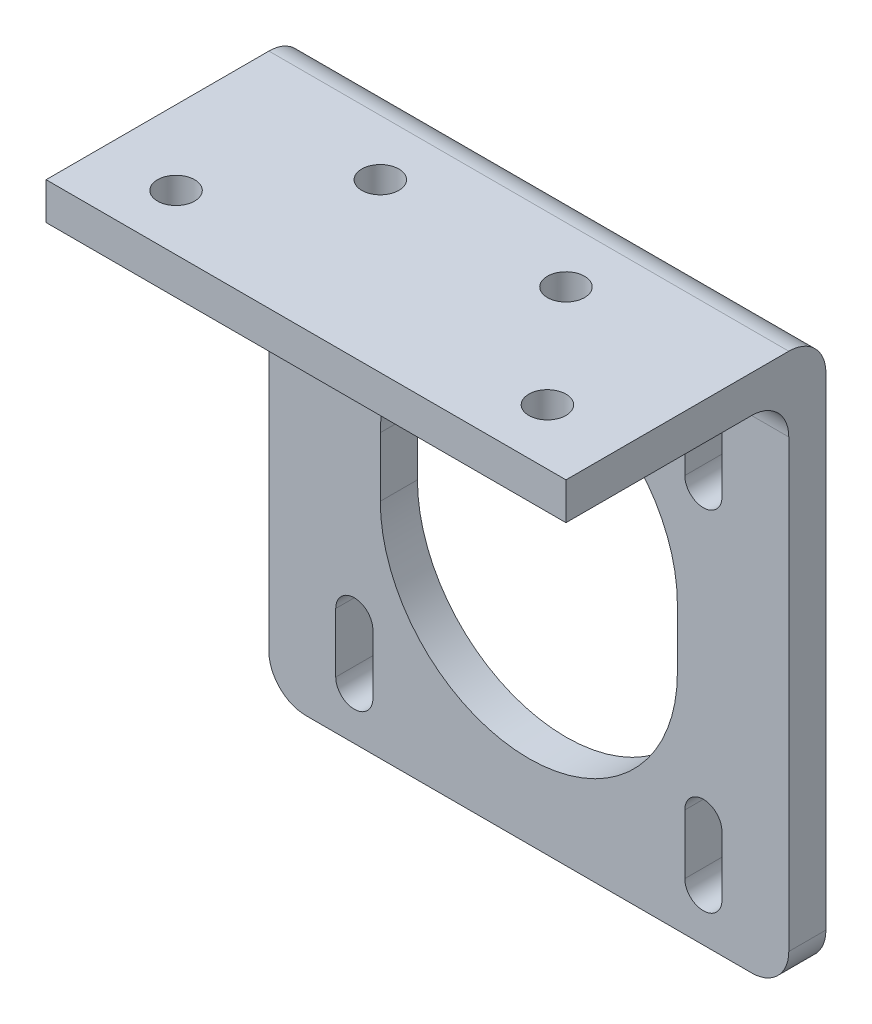
ISO-10303-21;
HEADER;
FILE_DESCRIPTION(('STEP AP214'),'2;1');
FILE_NAME('part.step','',(''),(''),'','','');
FILE_SCHEMA(('AUTOMOTIVE_DESIGN { 1 0 10303 214 1 1 1 1 }'));
ENDSEC;
DATA;
#1=APPLICATION_CONTEXT('core data for automotive mechanical design processes');
#2=APPLICATION_PROTOCOL_DEFINITION('international standard','automotive_design',2000,#1);
#3=PRODUCT_CONTEXT('',#1,'mechanical');
#4=PRODUCT('Part','Part','',(#3));
#5=PRODUCT_RELATED_PRODUCT_CATEGORY('part','',(#4));
#6=PRODUCT_DEFINITION_FORMATION('','',#4);
#7=PRODUCT_DEFINITION_CONTEXT('part definition',#1,'design');
#8=PRODUCT_DEFINITION('design','',#6,#7);
#9=PRODUCT_DEFINITION_SHAPE('','',#8);
#10=(LENGTH_UNIT() NAMED_UNIT(*) SI_UNIT(.MILLI.,.METRE.));
#11=(NAMED_UNIT(*) PLANE_ANGLE_UNIT() SI_UNIT($,.RADIAN.));
#12=(NAMED_UNIT(*) SI_UNIT($,.STERADIAN.) SOLID_ANGLE_UNIT());
#13=UNCERTAINTY_MEASURE_WITH_UNIT(LENGTH_MEASURE(1.E-05),#10,'distance_accuracy_value','');
#14=(GEOMETRIC_REPRESENTATION_CONTEXT(3) GLOBAL_UNCERTAINTY_ASSIGNED_CONTEXT((#13)) GLOBAL_UNIT_ASSIGNED_CONTEXT((#10,
#11,#12)) REPRESENTATION_CONTEXT('',''));
#15=CARTESIAN_POINT('',(0.,0.,0.));
#16=DIRECTION('',(0.,0.,1.));
#17=DIRECTION('',(1.,0.,0.));
#18=AXIS2_PLACEMENT_3D('',#15,#16,#17);
#19=CARTESIAN_POINT('',(-30.,-32.5,5.));
#20=DIRECTION('',(0.,0.,-1.));
#21=DIRECTION('',(-1.,0.,0.));
#22=AXIS2_PLACEMENT_3D('',#19,#20,#21);
#23=PLANE('',#22);
#24=DIRECTION('',(0.,-1.,0.));
#25=VECTOR('',#24,1.);
#26=CARTESIAN_POINT('',(-26.,24.,5.));
#27=LINE('',#26,#25);
#28=CARTESIAN_POINT('',(-26.,24.,5.));
#29=VERTEX_POINT('',#28);
#30=CARTESIAN_POINT('',(-26.,16.,5.));
#31=VERTEX_POINT('',#30);
#32=EDGE_CURVE('E485',#29,#31,#27,.T.);
#33=ORIENTED_EDGE('',*,*,#32,.F.);
#34=CARTESIAN_POINT('',(-23.5,24.,5.));
#35=DIRECTION('',(0.,0.,1.));
#36=DIRECTION('',(1.,0.,0.));
#37=AXIS2_PLACEMENT_3D('',#34,#35,#36);
#38=CIRCLE('',#37,2.49999999999999);
#39=CARTESIAN_POINT('',(-21.,24.,5.));
#40=VERTEX_POINT('',#39);
#41=EDGE_CURVE('E413',#40,#29,#38,.T.);
#42=ORIENTED_EDGE('',*,*,#41,.F.);
#43=DIRECTION('',(0.,1.,0.));
#44=VECTOR('',#43,1.);
#45=CARTESIAN_POINT('',(-21.,24.,5.));
#46=LINE('',#45,#44);
#47=CARTESIAN_POINT('',(-21.,16.,5.));
#48=VERTEX_POINT('',#47);
#49=EDGE_CURVE('E470',#48,#40,#46,.T.);
#50=ORIENTED_EDGE('',*,*,#49,.F.);
#51=CARTESIAN_POINT('',(-23.5,16.,5.));
#52=DIRECTION('',(0.,0.,1.));
#53=DIRECTION('',(1.,0.,0.));
#54=AXIS2_PLACEMENT_3D('',#51,#52,#53);
#55=CIRCLE('',#54,2.49999999999999);
#56=EDGE_CURVE('E489',#31,#48,#55,.T.);
#57=ORIENTED_EDGE('',*,*,#56,.F.);
#58=EDGE_LOOP('',(#33,#42,#50,#57));
#59=FACE_BOUND('',#58,.T.);
#60=DIRECTION('',(0.,-1.,0.));
#61=VECTOR('',#60,1.);
#62=CARTESIAN_POINT('',(-20.,0.500000000000003,5.));
#63=LINE('',#62,#61);
#64=CARTESIAN_POINT('',(-20.,0.5,5.));
#65=VERTEX_POINT('',#64);
#66=CARTESIAN_POINT('',(-20.,-7.5,5.));
#67=VERTEX_POINT('',#66);
#68=EDGE_CURVE('E355',#65,#67,#63,.T.);
#69=ORIENTED_EDGE('',*,*,#68,.F.);
#70=CARTESIAN_POINT('',(0.,0.5,5.));
#71=DIRECTION('',(0.,0.,1.));
#72=DIRECTION('',(1.,0.,0.));
#73=AXIS2_PLACEMENT_3D('',#70,#71,#72);
#74=CIRCLE('',#73,20.);
#75=CARTESIAN_POINT('',(20.,0.499999999999998,5.));
#76=VERTEX_POINT('',#75);
#77=EDGE_CURVE('E288',#76,#65,#74,.T.);
#78=ORIENTED_EDGE('',*,*,#77,.F.);
#79=DIRECTION('',(0.,1.,0.));
#80=VECTOR('',#79,1.);
#81=CARTESIAN_POINT('',(20.,0.499999999999998,5.));
#82=LINE('',#81,#80);
#83=CARTESIAN_POINT('',(20.,-7.5,5.));
#84=VERTEX_POINT('',#83);
#85=EDGE_CURVE('E340',#84,#76,#82,.T.);
#86=ORIENTED_EDGE('',*,*,#85,.F.);
#87=CARTESIAN_POINT('',(0.,-7.5,5.));
#88=DIRECTION('',(0.,0.,1.));
#89=DIRECTION('',(1.,0.,0.));
#90=AXIS2_PLACEMENT_3D('',#87,#88,#89);
#91=CIRCLE('',#90,20.);
#92=EDGE_CURVE('E359',#67,#84,#91,.T.);
#93=ORIENTED_EDGE('',*,*,#92,.F.);
#94=EDGE_LOOP('',(#69,#78,#86,#93));
#95=FACE_BOUND('',#94,.T.);
#96=DIRECTION('',(0.,-1.,0.));
#97=VECTOR('',#96,1.);
#98=CARTESIAN_POINT('',(21.,-23.,5.));
#99=LINE('',#98,#97);
#100=CARTESIAN_POINT('',(21.,-23.,5.));
#101=VERTEX_POINT('',#100);
#102=CARTESIAN_POINT('',(21.,-31.,5.));
#103=VERTEX_POINT('',#102);
#104=EDGE_CURVE('E310',#101,#103,#99,.T.);
#105=ORIENTED_EDGE('',*,*,#104,.F.);
#106=CARTESIAN_POINT('',(23.5,-23.,5.));
#107=DIRECTION('',(0.,0.,1.));
#108=DIRECTION('',(1.,0.,0.));
#109=AXIS2_PLACEMENT_3D('',#106,#107,#108);
#110=CIRCLE('',#109,2.5);
#111=CARTESIAN_POINT('',(26.,-23.,5.));
#112=VERTEX_POINT('',#111);
#113=EDGE_CURVE('E307',#112,#101,#110,.T.);
#114=ORIENTED_EDGE('',*,*,#113,.F.);
#115=DIRECTION('',(0.,1.,0.));
#116=VECTOR('',#115,1.);
#117=CARTESIAN_POINT('',(26.,-23.,5.));
#118=LINE('',#117,#116);
#119=CARTESIAN_POINT('',(26.,-31.,5.));
#120=VERTEX_POINT('',#119);
#121=EDGE_CURVE('E294',#120,#112,#118,.T.);
#122=ORIENTED_EDGE('',*,*,#121,.F.);
#123=CARTESIAN_POINT('',(23.5,-31.,5.));
#124=DIRECTION('',(0.,0.,1.));
#125=DIRECTION('',(1.,0.,0.));
#126=AXIS2_PLACEMENT_3D('',#123,#124,#125);
#127=CIRCLE('',#126,2.5);
#128=EDGE_CURVE('E315',#103,#120,#127,.T.);
#129=ORIENTED_EDGE('',*,*,#128,.F.);
#130=EDGE_LOOP('',(#105,#114,#122,#129));
#131=FACE_BOUND('',#130,.T.);
#132=DIRECTION('',(0.,-1.,0.));
#133=VECTOR('',#132,1.);
#134=CARTESIAN_POINT('',(21.,24.,5.));
#135=LINE('',#134,#133);
#136=CARTESIAN_POINT('',(21.,24.,5.));
#137=VERTEX_POINT('',#136);
#138=CARTESIAN_POINT('',(21.,16.,5.));
#139=VERTEX_POINT('',#138);
#140=EDGE_CURVE('E443',#137,#139,#135,.T.);
#141=ORIENTED_EDGE('',*,*,#140,.F.);
#142=CARTESIAN_POINT('',(23.5,24.,5.));
#143=DIRECTION('',(0.,0.,1.));
#144=DIRECTION('',(1.,0.,0.));
#145=AXIS2_PLACEMENT_3D('',#142,#143,#144);
#146=CIRCLE('',#145,2.49999999999999);
#147=CARTESIAN_POINT('',(26.,24.,5.));
#148=VERTEX_POINT('',#147);
#149=EDGE_CURVE('E325',#148,#137,#146,.T.);
#150=ORIENTED_EDGE('',*,*,#149,.F.);
#151=DIRECTION('',(0.,1.,0.));
#152=VECTOR('',#151,1.);
#153=CARTESIAN_POINT('',(26.,24.,5.));
#154=LINE('',#153,#152);
#155=CARTESIAN_POINT('',(26.,16.,5.));
#156=VERTEX_POINT('',#155);
#157=EDGE_CURVE('E428',#156,#148,#154,.T.);
#158=ORIENTED_EDGE('',*,*,#157,.F.);
#159=CARTESIAN_POINT('',(23.5,16.,5.));
#160=DIRECTION('',(0.,0.,1.));
#161=DIRECTION('',(1.,0.,0.));
#162=AXIS2_PLACEMENT_3D('',#159,#160,#161);
#163=CIRCLE('',#162,2.49999999999999);
#164=EDGE_CURVE('E447',#139,#156,#163,.T.);
#165=ORIENTED_EDGE('',*,*,#164,.F.);
#166=EDGE_LOOP('',(#141,#150,#158,#165));
#167=FACE_BOUND('',#166,.T.);
#168=DIRECTION('',(0.,-1.,0.));
#169=VECTOR('',#168,1.);
#170=CARTESIAN_POINT('',(-26.,-23.,5.));
#171=LINE('',#170,#169);
#172=CARTESIAN_POINT('',(-26.,-23.,5.));
#173=VERTEX_POINT('',#172);
#174=CARTESIAN_POINT('',(-26.,-31.,5.));
#175=VERTEX_POINT('',#174);
#176=EDGE_CURVE('E398',#173,#175,#171,.T.);
#177=ORIENTED_EDGE('',*,*,#176,.F.);
#178=CARTESIAN_POINT('',(-23.5,-23.,5.));
#179=DIRECTION('',(0.,0.,1.));
#180=DIRECTION('',(1.,0.,0.));
#181=AXIS2_PLACEMENT_3D('',#178,#179,#180);
#182=CIRCLE('',#181,2.5);
#183=CARTESIAN_POINT('',(-21.,-23.,5.));
#184=VERTEX_POINT('',#183);
#185=EDGE_CURVE('E395',#184,#173,#182,.T.);
#186=ORIENTED_EDGE('',*,*,#185,.F.);
#187=DIRECTION('',(0.,1.,0.));
#188=VECTOR('',#187,1.);
#189=CARTESIAN_POINT('',(-21.,-23.,5.));
#190=LINE('',#189,#188);
#191=CARTESIAN_POINT('',(-21.,-31.,5.));
#192=VERTEX_POINT('',#191);
#193=EDGE_CURVE('E382',#192,#184,#190,.T.);
#194=ORIENTED_EDGE('',*,*,#193,.F.);
#195=CARTESIAN_POINT('',(-23.5,-31.,5.));
#196=DIRECTION('',(0.,0.,1.));
#197=DIRECTION('',(1.,0.,0.));
#198=AXIS2_PLACEMENT_3D('',#195,#196,#197);
#199=CIRCLE('',#198,2.5);
#200=EDGE_CURVE('E403',#175,#192,#199,.T.);
#201=ORIENTED_EDGE('',*,*,#200,.F.);
#202=EDGE_LOOP('',(#177,#186,#194,#201));
#203=FACE_BOUND('',#202,.T.);
#204=DIRECTION('',(0.,1.,0.));
#205=VECTOR('',#204,1.);
#206=CARTESIAN_POINT('',(35.,-32.5,5.));
#207=LINE('',#206,#205);
#208=CARTESIAN_POINT('',(35.,-32.5,5.));
#209=VERTEX_POINT('',#208);
#210=CARTESIAN_POINT('',(35.,27.5,5.));
#211=VERTEX_POINT('',#210);
#212=EDGE_CURVE('E509',#209,#211,#207,.T.);
#213=ORIENTED_EDGE('',*,*,#212,.T.);
#214=DIRECTION('',(1.,0.,0.));
#215=VECTOR('',#214,1.);
#216=CARTESIAN_POINT('',(-35.,27.5,5.));
#217=LINE('',#216,#215);
#218=CARTESIAN_POINT('',(-35.,27.5,5.));
#219=VERTEX_POINT('',#218);
#220=EDGE_CURVE('E566',#211,#219,#217,.F.);
#221=ORIENTED_EDGE('',*,*,#220,.T.);
#222=DIRECTION('',(0.,-1.,0.));
#223=VECTOR('',#222,1.);
#224=CARTESIAN_POINT('',(-35.,-32.5,5.));
#225=LINE('',#224,#223);
#226=CARTESIAN_POINT('',(-35.,-32.5,5.));
#227=VERTEX_POINT('',#226);
#228=EDGE_CURVE('E513',#219,#227,#225,.T.);
#229=ORIENTED_EDGE('',*,*,#228,.T.);
#230=CARTESIAN_POINT('',(-30.,-32.5,5.));
#231=DIRECTION('',(0.,0.,1.));
#232=DIRECTION('',(-1.,0.,0.));
#233=AXIS2_PLACEMENT_3D('',#230,#231,#232);
#234=CIRCLE('',#233,5.);
#235=CARTESIAN_POINT('',(-30.,-37.5,5.));
#236=VERTEX_POINT('',#235);
#237=EDGE_CURVE('E517',#227,#236,#234,.T.);
#238=ORIENTED_EDGE('',*,*,#237,.T.);
#239=DIRECTION('',(1.,0.,0.));
#240=VECTOR('',#239,1.);
#241=CARTESIAN_POINT('',(-30.,-37.5,5.));
#242=LINE('',#241,#240);
#243=CARTESIAN_POINT('',(30.,-37.5,5.));
#244=VERTEX_POINT('',#243);
#245=EDGE_CURVE('E520',#236,#244,#242,.T.);
#246=ORIENTED_EDGE('',*,*,#245,.T.);
#247=CARTESIAN_POINT('',(30.,-32.5,5.));
#248=DIRECTION('',(0.,0.,1.));
#249=DIRECTION('',(1.,0.,0.));
#250=AXIS2_PLACEMENT_3D('',#247,#248,#249);
#251=CIRCLE('',#250,5.);
#252=EDGE_CURVE('E523',#244,#209,#251,.T.);
#253=ORIENTED_EDGE('',*,*,#252,.T.);
#254=EDGE_LOOP('',(#213,#221,#229,#238,#246,#253));
#255=FACE_BOUND('',#254,.T.);
#256=ADVANCED_FACE('F39',(#59,#95,#131,#167,#203,#255),#23,.F.);
#257=CARTESIAN_POINT('',(35.,-32.5,5.));
#258=DIRECTION('',(-1.,0.,0.));
#259=DIRECTION('',(0.,0.,1.));
#260=AXIS2_PLACEMENT_3D('',#257,#258,#259);
#261=PLANE('',#260);
#262=DIRECTION('',(0.,1.,0.));
#263=VECTOR('',#262,1.);
#264=CARTESIAN_POINT('',(35.,-32.5,0.));
#265=LINE('',#264,#263);
#266=CARTESIAN_POINT('',(35.,-32.5,0.));
#267=VERTEX_POINT('',#266);
#268=CARTESIAN_POINT('',(35.,32.5,0.));
#269=VERTEX_POINT('',#268);
#270=EDGE_CURVE('E499',#267,#269,#265,.T.);
#271=ORIENTED_EDGE('',*,*,#270,.T.);
#272=CARTESIAN_POINT('',(35.,32.5,5.));
#273=DIRECTION('',(-1.,0.,0.));
#274=DIRECTION('',(0.,0.,1.));
#275=AXIS2_PLACEMENT_3D('',#272,#273,#274);
#276=CIRCLE('',#275,5.);
#277=CARTESIAN_POINT('',(35.,37.5,5.));
#278=VERTEX_POINT('',#277);
#279=EDGE_CURVE('E575',#269,#278,#276,.F.);
#280=ORIENTED_EDGE('',*,*,#279,.T.);
#281=DIRECTION('',(0.,0.,-1.));
#282=VECTOR('',#281,1.);
#283=CARTESIAN_POINT('',(35.,37.5,5.));
#284=LINE('',#283,#282);
#285=CARTESIAN_POINT('',(35.,37.5,35.));
#286=VERTEX_POINT('',#285);
#287=EDGE_CURVE('E252',#286,#278,#284,.T.);
#288=ORIENTED_EDGE('',*,*,#287,.F.);
#289=DIRECTION('',(0.,1.,0.));
#290=VECTOR('',#289,1.);
#291=CARTESIAN_POINT('',(35.,32.5,35.));
#292=LINE('',#291,#290);
#293=CARTESIAN_POINT('',(35.,32.5,35.));
#294=VERTEX_POINT('',#293);
#295=EDGE_CURVE('E268',#294,#286,#292,.T.);
#296=ORIENTED_EDGE('',*,*,#295,.F.);
#297=DIRECTION('',(0.,0.,-1.));
#298=VECTOR('',#297,1.);
#299=CARTESIAN_POINT('',(35.,32.5,35.));
#300=LINE('',#299,#298);
#301=CARTESIAN_POINT('',(35.,32.5,10.));
#302=VERTEX_POINT('',#301);
#303=EDGE_CURVE('E282',#294,#302,#300,.T.);
#304=ORIENTED_EDGE('',*,*,#303,.T.);
#305=CARTESIAN_POINT('',(35.,27.5,10.));
#306=DIRECTION('',(-1.,0.,0.));
#307=DIRECTION('',(0.,0.,1.));
#308=AXIS2_PLACEMENT_3D('',#305,#306,#307);
#309=CIRCLE('',#308,5.);
#310=EDGE_CURVE('E48',#302,#211,#309,.T.);
#311=ORIENTED_EDGE('',*,*,#310,.T.);
#312=ORIENTED_EDGE('',*,*,#212,.F.);
#313=DIRECTION('',(0.,0.,-1.));
#314=VECTOR('',#313,1.);
#315=CARTESIAN_POINT('',(35.,-32.5,5.));
#316=LINE('',#315,#314);
#317=EDGE_CURVE('E526',#209,#267,#316,.T.);
#318=ORIENTED_EDGE('',*,*,#317,.T.);
#319=EDGE_LOOP('',(#271,#280,#288,#296,#304,#311,#312,#318));
#320=FACE_BOUND('',#319,.T.);
#321=ADVANCED_FACE('F581',(#320),#261,.F.);
#322=CARTESIAN_POINT('',(-35.,37.5,5.));
#323=DIRECTION('',(0.,-1.,0.));
#324=DIRECTION('',(0.,0.,-1.));
#325=AXIS2_PLACEMENT_3D('',#322,#323,#324);
#326=PLANE('',#325);
#327=CARTESIAN_POINT('',(25.,37.5,27.5));
#328=DIRECTION('',(0.,-1.,0.));
#329=DIRECTION('',(0.,0.,-1.));
#330=AXIS2_PLACEMENT_3D('',#327,#328,#329);
#331=CIRCLE('',#330,2.5);
#332=CARTESIAN_POINT('',(25.,37.5,25.));
#333=VERTEX_POINT('',#332);
#334=EDGE_CURVE('E270',#333,#333,#331,.T.);
#335=ORIENTED_EDGE('',*,*,#334,.T.);
#336=EDGE_LOOP('',(#335));
#337=FACE_BOUND('',#336,.T.);
#338=CARTESIAN_POINT('',(-25.,37.5,27.5));
#339=DIRECTION('',(0.,-1.,0.));
#340=DIRECTION('',(0.,0.,-1.));
#341=AXIS2_PLACEMENT_3D('',#338,#339,#340);
#342=CIRCLE('',#341,2.5);
#343=CARTESIAN_POINT('',(-25.,37.5,25.));
#344=VERTEX_POINT('',#343);
#345=EDGE_CURVE('E274',#344,#344,#342,.T.);
#346=ORIENTED_EDGE('',*,*,#345,.T.);
#347=EDGE_LOOP('',(#346));
#348=FACE_BOUND('',#347,.T.);
#349=CARTESIAN_POINT('',(12.5,37.5,12.5));
#350=DIRECTION('',(0.,-1.,0.));
#351=DIRECTION('',(0.,0.,-1.));
#352=AXIS2_PLACEMENT_3D('',#349,#350,#351);
#353=CIRCLE('',#352,2.5);
#354=CARTESIAN_POINT('',(12.5,37.5,10.));
#355=VERTEX_POINT('',#354);
#356=EDGE_CURVE('E649',#355,#355,#353,.T.);
#357=ORIENTED_EDGE('',*,*,#356,.T.);
#358=EDGE_LOOP('',(#357));
#359=FACE_BOUND('',#358,.T.);
#360=CARTESIAN_POINT('',(-12.5,37.5,12.5));
#361=DIRECTION('',(0.,-1.,0.));
#362=DIRECTION('',(0.,0.,-1.));
#363=AXIS2_PLACEMENT_3D('',#360,#361,#362);
#364=CIRCLE('',#363,2.5);
#365=CARTESIAN_POINT('',(-12.5,37.5,10.));
#366=VERTEX_POINT('',#365);
#367=EDGE_CURVE('E652',#366,#366,#364,.T.);
#368=ORIENTED_EDGE('',*,*,#367,.T.);
#369=EDGE_LOOP('',(#368));
#370=FACE_BOUND('',#369,.T.);
#371=ORIENTED_EDGE('',*,*,#287,.T.);
#372=DIRECTION('',(-1.,0.,0.));
#373=VECTOR('',#372,1.);
#374=CARTESIAN_POINT('',(-35.,37.5,5.));
#375=LINE('',#374,#373);
#376=CARTESIAN_POINT('',(-35.,37.5,5.));
#377=VERTEX_POINT('',#376);
#378=EDGE_CURVE('E250',#278,#377,#375,.T.);
#379=ORIENTED_EDGE('',*,*,#378,.T.);
#380=DIRECTION('',(0.,0.,-1.));
#381=VECTOR('',#380,1.);
#382=CARTESIAN_POINT('',(-35.,37.5,5.));
#383=LINE('',#382,#381);
#384=CARTESIAN_POINT('',(-35.,37.5,35.));
#385=VERTEX_POINT('',#384);
#386=EDGE_CURVE('E243',#385,#377,#383,.T.);
#387=ORIENTED_EDGE('',*,*,#386,.F.);
#388=DIRECTION('',(-1.,0.,0.));
#389=VECTOR('',#388,1.);
#390=CARTESIAN_POINT('',(35.,37.5,35.));
#391=LINE('',#390,#389);
#392=EDGE_CURVE('E248',#286,#385,#391,.T.);
#393=ORIENTED_EDGE('',*,*,#392,.F.);
#394=EDGE_LOOP('',(#371,#379,#387,#393));
#395=FACE_BOUND('',#394,.T.);
#396=ADVANCED_FACE('F246',(#337,#348,#359,#370,#395),#326,.F.);
#397=CARTESIAN_POINT('',(-35.,-32.5,5.));
#398=DIRECTION('',(1.,0.,0.));
#399=DIRECTION('',(0.,0.,-1.));
#400=AXIS2_PLACEMENT_3D('',#397,#398,#399);
#401=PLANE('',#400);
#402=ORIENTED_EDGE('',*,*,#386,.T.);
#403=CARTESIAN_POINT('',(-35.,32.5,5.));
#404=DIRECTION('',(1.,0.,0.));
#405=DIRECTION('',(0.,0.,-1.));
#406=AXIS2_PLACEMENT_3D('',#403,#404,#405);
#407=CIRCLE('',#406,5.);
#408=CARTESIAN_POINT('',(-35.,32.5,0.));
#409=VERTEX_POINT('',#408);
#410=EDGE_CURVE('E63',#377,#409,#407,.F.);
#411=ORIENTED_EDGE('',*,*,#410,.T.);
#412=DIRECTION('',(0.,-1.,0.));
#413=VECTOR('',#412,1.);
#414=CARTESIAN_POINT('',(-35.,-32.5,0.));
#415=LINE('',#414,#413);
#416=CARTESIAN_POINT('',(-35.,-32.5,0.));
#417=VERTEX_POINT('',#416);
#418=EDGE_CURVE('E529',#409,#417,#415,.T.);
#419=ORIENTED_EDGE('',*,*,#418,.T.);
#420=DIRECTION('',(0.,0.,-1.));
#421=VECTOR('',#420,1.);
#422=CARTESIAN_POINT('',(-35.,-32.5,5.));
#423=LINE('',#422,#421);
#424=EDGE_CURVE('E253',#227,#417,#423,.T.);
#425=ORIENTED_EDGE('',*,*,#424,.F.);
#426=ORIENTED_EDGE('',*,*,#228,.F.);
#427=CARTESIAN_POINT('',(-35.,27.5,10.));
#428=DIRECTION('',(1.,0.,0.));
#429=DIRECTION('',(0.,0.,-1.));
#430=AXIS2_PLACEMENT_3D('',#427,#428,#429);
#431=CIRCLE('',#430,5.);
#432=CARTESIAN_POINT('',(-35.,32.5,10.));
#433=VERTEX_POINT('',#432);
#434=EDGE_CURVE('E11',#219,#433,#431,.T.);
#435=ORIENTED_EDGE('',*,*,#434,.T.);
#436=DIRECTION('',(0.,0.,-1.));
#437=VECTOR('',#436,1.);
#438=CARTESIAN_POINT('',(-35.,32.5,35.));
#439=LINE('',#438,#437);
#440=CARTESIAN_POINT('',(-35.,32.5,35.));
#441=VERTEX_POINT('',#440);
#442=EDGE_CURVE('E259',#441,#433,#439,.T.);
#443=ORIENTED_EDGE('',*,*,#442,.F.);
#444=DIRECTION('',(0.,-1.,0.));
#445=VECTOR('',#444,1.);
#446=CARTESIAN_POINT('',(-35.,37.5,35.));
#447=LINE('',#446,#445);
#448=EDGE_CURVE('E256',#385,#441,#447,.T.);
#449=ORIENTED_EDGE('',*,*,#448,.F.);
#450=EDGE_LOOP('',(#402,#411,#419,#425,#426,#435,#443,#449));
#451=FACE_BOUND('',#450,.T.);
#452=ADVANCED_FACE('F257',(#451),#401,.F.);
#453=CARTESIAN_POINT('',(-30.,-32.5,5.));
#454=DIRECTION('',(0.,0.,-1.));
#455=DIRECTION('',(-1.,0.,0.));
#456=AXIS2_PLACEMENT_3D('',#453,#454,#455);
#457=CYLINDRICAL_SURFACE('',#456,5.);
#458=CARTESIAN_POINT('',(-30.,-32.5,0.));
#459=DIRECTION('',(0.,0.,1.));
#460=DIRECTION('',(-1.,0.,0.));
#461=AXIS2_PLACEMENT_3D('',#458,#459,#460);
#462=CIRCLE('',#461,5.);
#463=CARTESIAN_POINT('',(-30.,-37.5,0.));
#464=VERTEX_POINT('',#463);
#465=EDGE_CURVE('E532',#417,#464,#462,.T.);
#466=ORIENTED_EDGE('',*,*,#465,.T.);
#467=DIRECTION('',(0.,0.,-1.));
#468=VECTOR('',#467,1.);
#469=CARTESIAN_POINT('',(-30.,-37.5,5.));
#470=LINE('',#469,#468);
#471=EDGE_CURVE('E547',#236,#464,#470,.T.);
#472=ORIENTED_EDGE('',*,*,#471,.F.);
#473=ORIENTED_EDGE('',*,*,#237,.F.);
#474=ORIENTED_EDGE('',*,*,#424,.T.);
#475=EDGE_LOOP('',(#466,#472,#473,#474));
#476=FACE_BOUND('',#475,.T.);
#477=ADVANCED_FACE('F630',(#476),#457,.T.);
#478=CARTESIAN_POINT('',(-30.,-37.5,5.));
#479=DIRECTION('',(0.,1.,0.));
#480=DIRECTION('',(0.,0.,1.));
#481=AXIS2_PLACEMENT_3D('',#478,#479,#480);
#482=PLANE('',#481);
#483=DIRECTION('',(1.,0.,0.));
#484=VECTOR('',#483,1.);
#485=CARTESIAN_POINT('',(-30.,-37.5,0.));
#486=LINE('',#485,#484);
#487=CARTESIAN_POINT('',(30.,-37.5,0.));
#488=VERTEX_POINT('',#487);
#489=EDGE_CURVE('E535',#464,#488,#486,.T.);
#490=ORIENTED_EDGE('',*,*,#489,.T.);
#491=DIRECTION('',(0.,0.,-1.));
#492=VECTOR('',#491,1.);
#493=CARTESIAN_POINT('',(30.,-37.5,5.));
#494=LINE('',#493,#492);
#495=EDGE_CURVE('E543',#244,#488,#494,.T.);
#496=ORIENTED_EDGE('',*,*,#495,.F.);
#497=ORIENTED_EDGE('',*,*,#245,.F.);
#498=ORIENTED_EDGE('',*,*,#471,.T.);
#499=EDGE_LOOP('',(#490,#496,#497,#498));
#500=FACE_BOUND('',#499,.T.);
#501=ADVANCED_FACE('F626',(#500),#482,.F.);
#502=CARTESIAN_POINT('',(30.,-32.5,5.));
#503=DIRECTION('',(0.,0.,-1.));
#504=DIRECTION('',(-1.,0.,0.));
#505=AXIS2_PLACEMENT_3D('',#502,#503,#504);
#506=CYLINDRICAL_SURFACE('',#505,5.);
#507=CARTESIAN_POINT('',(30.,-32.5,0.));
#508=DIRECTION('',(0.,0.,1.));
#509=DIRECTION('',(1.,0.,0.));
#510=AXIS2_PLACEMENT_3D('',#507,#508,#509);
#511=CIRCLE('',#510,5.);
#512=EDGE_CURVE('E514',#488,#267,#511,.T.);
#513=ORIENTED_EDGE('',*,*,#512,.T.);
#514=ORIENTED_EDGE('',*,*,#317,.F.);
#515=ORIENTED_EDGE('',*,*,#252,.F.);
#516=ORIENTED_EDGE('',*,*,#495,.T.);
#517=EDGE_LOOP('',(#513,#514,#515,#516));
#518=FACE_BOUND('',#517,.T.);
#519=ADVANCED_FACE('F622',(#518),#506,.T.);
#520=CARTESIAN_POINT('',(-30.,-32.5,0.));
#521=DIRECTION('',(0.,0.,-1.));
#522=DIRECTION('',(-1.,0.,0.));
#523=AXIS2_PLACEMENT_3D('',#520,#521,#522);
#524=PLANE('',#523);
#525=CARTESIAN_POINT('',(-23.5,-23.,0.));
#526=DIRECTION('',(0.,0.,1.));
#527=DIRECTION('',(1.,0.,0.));
#528=AXIS2_PLACEMENT_3D('',#525,#526,#527);
#529=CIRCLE('',#528,2.5);
#530=CARTESIAN_POINT('',(-21.,-23.,0.));
#531=VERTEX_POINT('',#530);
#532=CARTESIAN_POINT('',(-26.,-23.,0.));
#533=VERTEX_POINT('',#532);
#534=EDGE_CURVE('E377',#531,#533,#529,.T.);
#535=ORIENTED_EDGE('',*,*,#534,.T.);
#536=DIRECTION('',(0.,-1.,0.));
#537=VECTOR('',#536,1.);
#538=CARTESIAN_POINT('',(-26.,-23.,0.));
#539=LINE('',#538,#537);
#540=CARTESIAN_POINT('',(-26.,-31.,0.));
#541=VERTEX_POINT('',#540);
#542=EDGE_CURVE('E381',#533,#541,#539,.T.);
#543=ORIENTED_EDGE('',*,*,#542,.T.);
#544=CARTESIAN_POINT('',(-23.5,-31.,0.));
#545=DIRECTION('',(0.,0.,1.));
#546=DIRECTION('',(1.,0.,0.));
#547=AXIS2_PLACEMENT_3D('',#544,#545,#546);
#548=CIRCLE('',#547,2.5);
#549=CARTESIAN_POINT('',(-21.,-31.,0.));
#550=VERTEX_POINT('',#549);
#551=EDGE_CURVE('E386',#541,#550,#548,.T.);
#552=ORIENTED_EDGE('',*,*,#551,.T.);
#553=DIRECTION('',(0.,1.,0.));
#554=VECTOR('',#553,1.);
#555=CARTESIAN_POINT('',(-21.,-23.,0.));
#556=LINE('',#555,#554);
#557=EDGE_CURVE('E390',#550,#531,#556,.T.);
#558=ORIENTED_EDGE('',*,*,#557,.T.);
#559=EDGE_LOOP('',(#535,#543,#552,#558));
#560=FACE_BOUND('',#559,.T.);
#561=CARTESIAN_POINT('',(23.5,24.,0.));
#562=DIRECTION('',(0.,0.,1.));
#563=DIRECTION('',(1.,0.,0.));
#564=AXIS2_PLACEMENT_3D('',#561,#562,#563);
#565=CIRCLE('',#564,2.49999999999999);
#566=CARTESIAN_POINT('',(26.,24.,0.));
#567=VERTEX_POINT('',#566);
#568=CARTESIAN_POINT('',(21.,24.,0.));
#569=VERTEX_POINT('',#568);
#570=EDGE_CURVE('E423',#567,#569,#565,.T.);
#571=ORIENTED_EDGE('',*,*,#570,.T.);
#572=DIRECTION('',(0.,-1.,0.));
#573=VECTOR('',#572,1.);
#574=CARTESIAN_POINT('',(21.,24.,0.));
#575=LINE('',#574,#573);
#576=CARTESIAN_POINT('',(21.,16.,0.));
#577=VERTEX_POINT('',#576);
#578=EDGE_CURVE('E427',#569,#577,#575,.T.);
#579=ORIENTED_EDGE('',*,*,#578,.T.);
#580=CARTESIAN_POINT('',(23.5,16.,0.));
#581=DIRECTION('',(0.,0.,1.));
#582=DIRECTION('',(1.,0.,0.));
#583=AXIS2_PLACEMENT_3D('',#580,#581,#582);
#584=CIRCLE('',#583,2.49999999999999);
#585=CARTESIAN_POINT('',(26.,16.,0.));
#586=VERTEX_POINT('',#585);
#587=EDGE_CURVE('E432',#577,#586,#584,.T.);
#588=ORIENTED_EDGE('',*,*,#587,.T.);
#589=DIRECTION('',(0.,1.,0.));
#590=VECTOR('',#589,1.);
#591=CARTESIAN_POINT('',(26.,24.,0.));
#592=LINE('',#591,#590);
#593=EDGE_CURVE('E436',#586,#567,#592,.T.);
#594=ORIENTED_EDGE('',*,*,#593,.T.);
#595=EDGE_LOOP('',(#571,#579,#588,#594));
#596=FACE_BOUND('',#595,.T.);
#597=CARTESIAN_POINT('',(23.5,-23.,0.));
#598=DIRECTION('',(0.,0.,1.));
#599=DIRECTION('',(1.,0.,0.));
#600=AXIS2_PLACEMENT_3D('',#597,#598,#599);
#601=CIRCLE('',#600,2.5);
#602=CARTESIAN_POINT('',(26.,-23.,0.));
#603=VERTEX_POINT('',#602);
#604=CARTESIAN_POINT('',(21.,-23.,0.));
#605=VERTEX_POINT('',#604);
#606=EDGE_CURVE('E289',#603,#605,#601,.T.);
#607=ORIENTED_EDGE('',*,*,#606,.T.);
#608=DIRECTION('',(0.,-1.,0.));
#609=VECTOR('',#608,1.);
#610=CARTESIAN_POINT('',(21.,-23.,0.));
#611=LINE('',#610,#609);
#612=CARTESIAN_POINT('',(21.,-31.,0.));
#613=VERTEX_POINT('',#612);
#614=EDGE_CURVE('E293',#605,#613,#611,.T.);
#615=ORIENTED_EDGE('',*,*,#614,.T.);
#616=CARTESIAN_POINT('',(23.5,-31.,0.));
#617=DIRECTION('',(0.,0.,1.));
#618=DIRECTION('',(1.,0.,0.));
#619=AXIS2_PLACEMENT_3D('',#616,#617,#618);
#620=CIRCLE('',#619,2.5);
#621=CARTESIAN_POINT('',(26.,-31.,0.));
#622=VERTEX_POINT('',#621);
#623=EDGE_CURVE('E298',#613,#622,#620,.T.);
#624=ORIENTED_EDGE('',*,*,#623,.T.);
#625=DIRECTION('',(0.,1.,0.));
#626=VECTOR('',#625,1.);
#627=CARTESIAN_POINT('',(26.,-23.,0.));
#628=LINE('',#627,#626);
#629=EDGE_CURVE('E302',#622,#603,#628,.T.);
#630=ORIENTED_EDGE('',*,*,#629,.T.);
#631=EDGE_LOOP('',(#607,#615,#624,#630));
#632=FACE_BOUND('',#631,.T.);
#633=CARTESIAN_POINT('',(0.,0.5,0.));
#634=DIRECTION('',(0.,0.,1.));
#635=DIRECTION('',(1.,0.,0.));
#636=AXIS2_PLACEMENT_3D('',#633,#634,#635);
#637=CIRCLE('',#636,20.);
#638=CARTESIAN_POINT('',(20.,0.499999999999998,0.));
#639=VERTEX_POINT('',#638);
#640=CARTESIAN_POINT('',(-20.,0.500000000000003,0.));
#641=VERTEX_POINT('',#640);
#642=EDGE_CURVE('E335',#639,#641,#637,.T.);
#643=ORIENTED_EDGE('',*,*,#642,.T.);
#644=DIRECTION('',(0.,-1.,0.));
#645=VECTOR('',#644,1.);
#646=CARTESIAN_POINT('',(-20.,0.500000000000003,0.));
#647=LINE('',#646,#645);
#648=CARTESIAN_POINT('',(-20.,-7.5,0.));
#649=VERTEX_POINT('',#648);
#650=EDGE_CURVE('E339',#641,#649,#647,.T.);
#651=ORIENTED_EDGE('',*,*,#650,.T.);
#652=CARTESIAN_POINT('',(0.,-7.5,0.));
#653=DIRECTION('',(0.,0.,1.));
#654=DIRECTION('',(1.,0.,0.));
#655=AXIS2_PLACEMENT_3D('',#652,#653,#654);
#656=CIRCLE('',#655,20.);
#657=CARTESIAN_POINT('',(20.,-7.5,0.));
#658=VERTEX_POINT('',#657);
#659=EDGE_CURVE('E344',#649,#658,#656,.T.);
#660=ORIENTED_EDGE('',*,*,#659,.T.);
#661=DIRECTION('',(0.,1.,0.));
#662=VECTOR('',#661,1.);
#663=CARTESIAN_POINT('',(20.,0.499999999999998,0.));
#664=LINE('',#663,#662);
#665=EDGE_CURVE('E348',#658,#639,#664,.T.);
#666=ORIENTED_EDGE('',*,*,#665,.T.);
#667=EDGE_LOOP('',(#643,#651,#660,#666));
#668=FACE_BOUND('',#667,.T.);
#669=CARTESIAN_POINT('',(-23.5,24.,0.));
#670=DIRECTION('',(0.,0.,1.));
#671=DIRECTION('',(1.,0.,0.));
#672=AXIS2_PLACEMENT_3D('',#669,#670,#671);
#673=CIRCLE('',#672,2.49999999999999);
#674=CARTESIAN_POINT('',(-21.,24.,0.));
#675=VERTEX_POINT('',#674);
#676=CARTESIAN_POINT('',(-26.,24.,0.));
#677=VERTEX_POINT('',#676);
#678=EDGE_CURVE('E465',#675,#677,#673,.T.);
#679=ORIENTED_EDGE('',*,*,#678,.T.);
#680=DIRECTION('',(0.,-1.,0.));
#681=VECTOR('',#680,1.);
#682=CARTESIAN_POINT('',(-26.,24.,0.));
#683=LINE('',#682,#681);
#684=CARTESIAN_POINT('',(-26.,16.,0.));
#685=VERTEX_POINT('',#684);
#686=EDGE_CURVE('E469',#677,#685,#683,.T.);
#687=ORIENTED_EDGE('',*,*,#686,.T.);
#688=CARTESIAN_POINT('',(-23.5,16.,0.));
#689=DIRECTION('',(0.,0.,1.));
#690=DIRECTION('',(1.,0.,0.));
#691=AXIS2_PLACEMENT_3D('',#688,#689,#690);
#692=CIRCLE('',#691,2.49999999999999);
#693=CARTESIAN_POINT('',(-21.,16.,0.));
#694=VERTEX_POINT('',#693);
#695=EDGE_CURVE('E474',#685,#694,#692,.T.);
#696=ORIENTED_EDGE('',*,*,#695,.T.);
#697=DIRECTION('',(0.,1.,0.));
#698=VECTOR('',#697,1.);
#699=CARTESIAN_POINT('',(-21.,24.,0.));
#700=LINE('',#699,#698);
#701=EDGE_CURVE('E478',#694,#675,#700,.T.);
#702=ORIENTED_EDGE('',*,*,#701,.T.);
#703=EDGE_LOOP('',(#679,#687,#696,#702));
#704=FACE_BOUND('',#703,.T.);
#705=ORIENTED_EDGE('',*,*,#418,.F.);
#706=DIRECTION('',(-1.,0.,0.));
#707=VECTOR('',#706,1.);
#708=CARTESIAN_POINT('',(35.,32.5,0.));
#709=LINE('',#708,#707);
#710=EDGE_CURVE('E55',#409,#269,#709,.F.);
#711=ORIENTED_EDGE('',*,*,#710,.T.);
#712=ORIENTED_EDGE('',*,*,#270,.F.);
#713=ORIENTED_EDGE('',*,*,#512,.F.);
#714=ORIENTED_EDGE('',*,*,#489,.F.);
#715=ORIENTED_EDGE('',*,*,#465,.F.);
#716=EDGE_LOOP('',(#705,#711,#712,#713,#714,#715));
#717=FACE_BOUND('',#716,.T.);
#718=ADVANCED_FACE('F619',(#560,#596,#632,#668,#704,#717),#524,.T.);
#719=CARTESIAN_POINT('',(-23.5,24.,0.));
#720=DIRECTION('',(0.,0.,1.));
#721=DIRECTION('',(1.,0.,0.));
#722=AXIS2_PLACEMENT_3D('',#719,#720,#721);
#723=CYLINDRICAL_SURFACE('',#722,2.49999999999999);
#724=ORIENTED_EDGE('',*,*,#41,.T.);
#725=DIRECTION('',(0.,0.,1.));
#726=VECTOR('',#725,1.);
#727=CARTESIAN_POINT('',(-26.,24.,0.));
#728=LINE('',#727,#726);
#729=EDGE_CURVE('E482',#677,#29,#728,.T.);
#730=ORIENTED_EDGE('',*,*,#729,.F.);
#731=ORIENTED_EDGE('',*,*,#678,.F.);
#732=DIRECTION('',(0.,0.,1.));
#733=VECTOR('',#732,1.);
#734=CARTESIAN_POINT('',(-21.,24.,0.));
#735=LINE('',#734,#733);
#736=EDGE_CURVE('E496',#675,#40,#735,.T.);
#737=ORIENTED_EDGE('',*,*,#736,.T.);
#738=EDGE_LOOP('',(#724,#730,#731,#737));
#739=FACE_BOUND('',#738,.T.);
#740=ADVANCED_FACE('F617',(#739),#723,.F.);
#741=CARTESIAN_POINT('',(-21.,24.,0.));
#742=DIRECTION('',(1.,0.,0.));
#743=DIRECTION('',(0.,0.,-1.));
#744=AXIS2_PLACEMENT_3D('',#741,#742,#743);
#745=PLANE('',#744);
#746=ORIENTED_EDGE('',*,*,#49,.T.);
#747=ORIENTED_EDGE('',*,*,#736,.F.);
#748=ORIENTED_EDGE('',*,*,#701,.F.);
#749=DIRECTION('',(0.,0.,1.));
#750=VECTOR('',#749,1.);
#751=CARTESIAN_POINT('',(-21.,16.,0.));
#752=LINE('',#751,#750);
#753=EDGE_CURVE('E500',#694,#48,#752,.T.);
#754=ORIENTED_EDGE('',*,*,#753,.T.);
#755=EDGE_LOOP('',(#746,#747,#748,#754));
#756=FACE_BOUND('',#755,.T.);
#757=ADVANCED_FACE('F759',(#756),#745,.F.);
#758=CARTESIAN_POINT('',(-23.5,16.,0.));
#759=DIRECTION('',(0.,0.,1.));
#760=DIRECTION('',(1.,0.,0.));
#761=AXIS2_PLACEMENT_3D('',#758,#759,#760);
#762=CYLINDRICAL_SURFACE('',#761,2.49999999999999);
#763=ORIENTED_EDGE('',*,*,#56,.T.);
#764=ORIENTED_EDGE('',*,*,#753,.F.);
#765=ORIENTED_EDGE('',*,*,#695,.F.);
#766=DIRECTION('',(0.,0.,1.));
#767=VECTOR('',#766,1.);
#768=CARTESIAN_POINT('',(-26.,16.,0.));
#769=LINE('',#768,#767);
#770=EDGE_CURVE('E503',#685,#31,#769,.T.);
#771=ORIENTED_EDGE('',*,*,#770,.T.);
#772=EDGE_LOOP('',(#763,#764,#765,#771));
#773=FACE_BOUND('',#772,.T.);
#774=ADVANCED_FACE('F762',(#773),#762,.F.);
#775=CARTESIAN_POINT('',(-26.,24.,0.));
#776=DIRECTION('',(-1.,0.,0.));
#777=DIRECTION('',(0.,0.,1.));
#778=AXIS2_PLACEMENT_3D('',#775,#776,#777);
#779=PLANE('',#778);
#780=ORIENTED_EDGE('',*,*,#32,.T.);
#781=ORIENTED_EDGE('',*,*,#770,.F.);
#782=ORIENTED_EDGE('',*,*,#686,.F.);
#783=ORIENTED_EDGE('',*,*,#729,.T.);
#784=EDGE_LOOP('',(#780,#781,#782,#783));
#785=FACE_BOUND('',#784,.T.);
#786=ADVANCED_FACE('F727',(#785),#779,.F.);
#787=CARTESIAN_POINT('',(0.,0.5,0.));
#788=DIRECTION('',(0.,0.,1.));
#789=DIRECTION('',(1.,0.,0.));
#790=AXIS2_PLACEMENT_3D('',#787,#788,#789);
#791=CYLINDRICAL_SURFACE('',#790,20.);
#792=ORIENTED_EDGE('',*,*,#77,.T.);
#793=DIRECTION('',(0.,0.,1.));
#794=VECTOR('',#793,1.);
#795=CARTESIAN_POINT('',(-20.,0.500000000000003,0.));
#796=LINE('',#795,#794);
#797=EDGE_CURVE('E352',#641,#65,#796,.T.);
#798=ORIENTED_EDGE('',*,*,#797,.F.);
#799=ORIENTED_EDGE('',*,*,#642,.F.);
#800=DIRECTION('',(0.,0.,1.));
#801=VECTOR('',#800,1.);
#802=CARTESIAN_POINT('',(20.,0.499999999999998,0.));
#803=LINE('',#802,#801);
#804=EDGE_CURVE('E311',#639,#76,#803,.T.);
#805=ORIENTED_EDGE('',*,*,#804,.T.);
#806=EDGE_LOOP('',(#792,#798,#799,#805));
#807=FACE_BOUND('',#806,.T.);
#808=ADVANCED_FACE('F717',(#807),#791,.F.);
#809=CARTESIAN_POINT('',(20.,0.499999999999998,0.));
#810=DIRECTION('',(1.,0.,0.));
#811=DIRECTION('',(0.,0.,-1.));
#812=AXIS2_PLACEMENT_3D('',#809,#810,#811);
#813=PLANE('',#812);
#814=ORIENTED_EDGE('',*,*,#85,.T.);
#815=ORIENTED_EDGE('',*,*,#804,.F.);
#816=ORIENTED_EDGE('',*,*,#665,.F.);
#817=DIRECTION('',(0.,0.,1.));
#818=VECTOR('',#817,1.);
#819=CARTESIAN_POINT('',(20.,-7.5,0.));
#820=LINE('',#819,#818);
#821=EDGE_CURVE('E368',#658,#84,#820,.T.);
#822=ORIENTED_EDGE('',*,*,#821,.T.);
#823=EDGE_LOOP('',(#814,#815,#816,#822));
#824=FACE_BOUND('',#823,.T.);
#825=ADVANCED_FACE('F713',(#824),#813,.F.);
#826=CARTESIAN_POINT('',(0.,-7.5,0.));
#827=DIRECTION('',(0.,0.,1.));
#828=DIRECTION('',(1.,0.,0.));
#829=AXIS2_PLACEMENT_3D('',#826,#827,#828);
#830=CYLINDRICAL_SURFACE('',#829,20.);
#831=ORIENTED_EDGE('',*,*,#92,.T.);
#832=ORIENTED_EDGE('',*,*,#821,.F.);
#833=ORIENTED_EDGE('',*,*,#659,.F.);
#834=DIRECTION('',(0.,0.,1.));
#835=VECTOR('',#834,1.);
#836=CARTESIAN_POINT('',(-20.,-7.5,0.));
#837=LINE('',#836,#835);
#838=EDGE_CURVE('E371',#649,#67,#837,.T.);
#839=ORIENTED_EDGE('',*,*,#838,.T.);
#840=EDGE_LOOP('',(#831,#832,#833,#839));
#841=FACE_BOUND('',#840,.T.);
#842=ADVANCED_FACE('F716',(#841),#830,.F.);
#843=CARTESIAN_POINT('',(-20.,0.500000000000003,0.));
#844=DIRECTION('',(-1.,0.,0.));
#845=DIRECTION('',(0.,0.,1.));
#846=AXIS2_PLACEMENT_3D('',#843,#844,#845);
#847=PLANE('',#846);
#848=ORIENTED_EDGE('',*,*,#68,.T.);
#849=ORIENTED_EDGE('',*,*,#838,.F.);
#850=ORIENTED_EDGE('',*,*,#650,.F.);
#851=ORIENTED_EDGE('',*,*,#797,.T.);
#852=EDGE_LOOP('',(#848,#849,#850,#851));
#853=FACE_BOUND('',#852,.T.);
#854=ADVANCED_FACE('F711',(#853),#847,.F.);
#855=CARTESIAN_POINT('',(23.5,-23.,0.));
#856=DIRECTION('',(0.,0.,1.));
#857=DIRECTION('',(1.,0.,0.));
#858=AXIS2_PLACEMENT_3D('',#855,#856,#857);
#859=CYLINDRICAL_SURFACE('',#858,2.5);
#860=ORIENTED_EDGE('',*,*,#113,.T.);
#861=DIRECTION('',(0.,0.,1.));
#862=VECTOR('',#861,1.);
#863=CARTESIAN_POINT('',(21.,-23.,0.));
#864=LINE('',#863,#862);
#865=EDGE_CURVE('E306',#605,#101,#864,.T.);
#866=ORIENTED_EDGE('',*,*,#865,.F.);
#867=ORIENTED_EDGE('',*,*,#606,.F.);
#868=DIRECTION('',(0.,0.,1.));
#869=VECTOR('',#868,1.);
#870=CARTESIAN_POINT('',(26.,-23.,0.));
#871=LINE('',#870,#869);
#872=EDGE_CURVE('E322',#603,#112,#871,.T.);
#873=ORIENTED_EDGE('',*,*,#872,.T.);
#874=EDGE_LOOP('',(#860,#866,#867,#873));
#875=FACE_BOUND('',#874,.T.);
#876=ADVANCED_FACE('F699',(#875),#859,.F.);
#877=CARTESIAN_POINT('',(26.,-23.,0.));
#878=DIRECTION('',(1.,0.,0.));
#879=DIRECTION('',(0.,0.,-1.));
#880=AXIS2_PLACEMENT_3D('',#877,#878,#879);
#881=PLANE('',#880);
#882=ORIENTED_EDGE('',*,*,#121,.T.);
#883=ORIENTED_EDGE('',*,*,#872,.F.);
#884=ORIENTED_EDGE('',*,*,#629,.F.);
#885=DIRECTION('',(0.,0.,1.));
#886=VECTOR('',#885,1.);
#887=CARTESIAN_POINT('',(26.,-31.,0.));
#888=LINE('',#887,#886);
#889=EDGE_CURVE('E326',#622,#120,#888,.T.);
#890=ORIENTED_EDGE('',*,*,#889,.T.);
#891=EDGE_LOOP('',(#882,#883,#884,#890));
#892=FACE_BOUND('',#891,.T.);
#893=ADVANCED_FACE('F695',(#892),#881,.F.);
#894=CARTESIAN_POINT('',(23.5,-31.,0.));
#895=DIRECTION('',(0.,0.,1.));
#896=DIRECTION('',(1.,0.,0.));
#897=AXIS2_PLACEMENT_3D('',#894,#895,#896);
#898=CYLINDRICAL_SURFACE('',#897,2.5);
#899=ORIENTED_EDGE('',*,*,#128,.T.);
#900=ORIENTED_EDGE('',*,*,#889,.F.);
#901=ORIENTED_EDGE('',*,*,#623,.F.);
#902=DIRECTION('',(0.,0.,1.));
#903=VECTOR('',#902,1.);
#904=CARTESIAN_POINT('',(21.,-31.,0.));
#905=LINE('',#904,#903);
#906=EDGE_CURVE('E329',#613,#103,#905,.T.);
#907=ORIENTED_EDGE('',*,*,#906,.T.);
#908=EDGE_LOOP('',(#899,#900,#901,#907));
#909=FACE_BOUND('',#908,.T.);
#910=ADVANCED_FACE('F698',(#909),#898,.F.);
#911=CARTESIAN_POINT('',(21.,-23.,0.));
#912=DIRECTION('',(-1.,0.,0.));
#913=DIRECTION('',(0.,0.,1.));
#914=AXIS2_PLACEMENT_3D('',#911,#912,#913);
#915=PLANE('',#914);
#916=ORIENTED_EDGE('',*,*,#104,.T.);
#917=ORIENTED_EDGE('',*,*,#906,.F.);
#918=ORIENTED_EDGE('',*,*,#614,.F.);
#919=ORIENTED_EDGE('',*,*,#865,.T.);
#920=EDGE_LOOP('',(#916,#917,#918,#919));
#921=FACE_BOUND('',#920,.T.);
#922=ADVANCED_FACE('F703',(#921),#915,.F.);
#923=CARTESIAN_POINT('',(23.5,24.,0.));
#924=DIRECTION('',(0.,0.,1.));
#925=DIRECTION('',(1.,0.,0.));
#926=AXIS2_PLACEMENT_3D('',#923,#924,#925);
#927=CYLINDRICAL_SURFACE('',#926,2.49999999999999);
#928=ORIENTED_EDGE('',*,*,#149,.T.);
#929=DIRECTION('',(0.,0.,1.));
#930=VECTOR('',#929,1.);
#931=CARTESIAN_POINT('',(21.,24.,0.));
#932=LINE('',#931,#930);
#933=EDGE_CURVE('E440',#569,#137,#932,.T.);
#934=ORIENTED_EDGE('',*,*,#933,.F.);
#935=ORIENTED_EDGE('',*,*,#570,.F.);
#936=DIRECTION('',(0.,0.,1.));
#937=VECTOR('',#936,1.);
#938=CARTESIAN_POINT('',(26.,24.,0.));
#939=LINE('',#938,#937);
#940=EDGE_CURVE('E399',#567,#148,#939,.T.);
#941=ORIENTED_EDGE('',*,*,#940,.T.);
#942=EDGE_LOOP('',(#928,#934,#935,#941));
#943=FACE_BOUND('',#942,.T.);
#944=ADVANCED_FACE('F707',(#943),#927,.F.);
#945=CARTESIAN_POINT('',(26.,24.,0.));
#946=DIRECTION('',(1.,0.,0.));
#947=DIRECTION('',(0.,0.,-1.));
#948=AXIS2_PLACEMENT_3D('',#945,#946,#947);
#949=PLANE('',#948);
#950=ORIENTED_EDGE('',*,*,#157,.T.);
#951=ORIENTED_EDGE('',*,*,#940,.F.);
#952=ORIENTED_EDGE('',*,*,#593,.F.);
#953=DIRECTION('',(0.,0.,1.));
#954=VECTOR('',#953,1.);
#955=CARTESIAN_POINT('',(26.,16.,0.));
#956=LINE('',#955,#954);
#957=EDGE_CURVE('E456',#586,#156,#956,.T.);
#958=ORIENTED_EDGE('',*,*,#957,.T.);
#959=EDGE_LOOP('',(#950,#951,#952,#958));
#960=FACE_BOUND('',#959,.T.);
#961=ADVANCED_FACE('F745',(#960),#949,.F.);
#962=CARTESIAN_POINT('',(23.5,16.,0.));
#963=DIRECTION('',(0.,0.,1.));
#964=DIRECTION('',(1.,0.,0.));
#965=AXIS2_PLACEMENT_3D('',#962,#963,#964);
#966=CYLINDRICAL_SURFACE('',#965,2.49999999999999);
#967=ORIENTED_EDGE('',*,*,#164,.T.);
#968=ORIENTED_EDGE('',*,*,#957,.F.);
#969=ORIENTED_EDGE('',*,*,#587,.F.);
#970=DIRECTION('',(0.,0.,1.));
#971=VECTOR('',#970,1.);
#972=CARTESIAN_POINT('',(21.,16.,0.));
#973=LINE('',#972,#971);
#974=EDGE_CURVE('E459',#577,#139,#973,.T.);
#975=ORIENTED_EDGE('',*,*,#974,.T.);
#976=EDGE_LOOP('',(#967,#968,#969,#975));
#977=FACE_BOUND('',#976,.T.);
#978=ADVANCED_FACE('F748',(#977),#966,.F.);
#979=CARTESIAN_POINT('',(21.,24.,0.));
#980=DIRECTION('',(-1.,0.,0.));
#981=DIRECTION('',(0.,0.,1.));
#982=AXIS2_PLACEMENT_3D('',#979,#980,#981);
#983=PLANE('',#982);
#984=ORIENTED_EDGE('',*,*,#140,.T.);
#985=ORIENTED_EDGE('',*,*,#974,.F.);
#986=ORIENTED_EDGE('',*,*,#578,.F.);
#987=ORIENTED_EDGE('',*,*,#933,.T.);
#988=EDGE_LOOP('',(#984,#985,#986,#987));
#989=FACE_BOUND('',#988,.T.);
#990=ADVANCED_FACE('F743',(#989),#983,.F.);
#991=CARTESIAN_POINT('',(-23.5,-23.,0.));
#992=DIRECTION('',(0.,0.,1.));
#993=DIRECTION('',(1.,0.,0.));
#994=AXIS2_PLACEMENT_3D('',#991,#992,#993);
#995=CYLINDRICAL_SURFACE('',#994,2.5);
#996=ORIENTED_EDGE('',*,*,#185,.T.);
#997=DIRECTION('',(0.,0.,1.));
#998=VECTOR('',#997,1.);
#999=CARTESIAN_POINT('',(-26.,-23.,0.));
#1000=LINE('',#999,#998);
#1001=EDGE_CURVE('E394',#533,#173,#1000,.T.);
#1002=ORIENTED_EDGE('',*,*,#1001,.F.);
#1003=ORIENTED_EDGE('',*,*,#534,.F.);
#1004=DIRECTION('',(0.,0.,1.));
#1005=VECTOR('',#1004,1.);
#1006=CARTESIAN_POINT('',(-21.,-23.,0.));
#1007=LINE('',#1006,#1005);
#1008=EDGE_CURVE('E410',#531,#184,#1007,.T.);
#1009=ORIENTED_EDGE('',*,*,#1008,.T.);
#1010=EDGE_LOOP('',(#996,#1002,#1003,#1009));
#1011=FACE_BOUND('',#1010,.T.);
#1012=ADVANCED_FACE('F733',(#1011),#995,.F.);
#1013=CARTESIAN_POINT('',(-21.,-23.,0.));
#1014=DIRECTION('',(1.,0.,0.));
#1015=DIRECTION('',(0.,0.,-1.));
#1016=AXIS2_PLACEMENT_3D('',#1013,#1014,#1015);
#1017=PLANE('',#1016);
#1018=ORIENTED_EDGE('',*,*,#193,.T.);
#1019=ORIENTED_EDGE('',*,*,#1008,.F.);
#1020=ORIENTED_EDGE('',*,*,#557,.F.);
#1021=DIRECTION('',(0.,0.,1.));
#1022=VECTOR('',#1021,1.);
#1023=CARTESIAN_POINT('',(-21.,-31.,0.));
#1024=LINE('',#1023,#1022);
#1025=EDGE_CURVE('E414',#550,#192,#1024,.T.);
#1026=ORIENTED_EDGE('',*,*,#1025,.T.);
#1027=EDGE_LOOP('',(#1018,#1019,#1020,#1026));
#1028=FACE_BOUND('',#1027,.T.);
#1029=ADVANCED_FACE('F729',(#1028),#1017,.F.);
#1030=CARTESIAN_POINT('',(-23.5,-31.,0.));
#1031=DIRECTION('',(0.,0.,1.));
#1032=DIRECTION('',(1.,0.,0.));
#1033=AXIS2_PLACEMENT_3D('',#1030,#1031,#1032);
#1034=CYLINDRICAL_SURFACE('',#1033,2.5);
#1035=ORIENTED_EDGE('',*,*,#200,.T.);
#1036=ORIENTED_EDGE('',*,*,#1025,.F.);
#1037=ORIENTED_EDGE('',*,*,#551,.F.);
#1038=DIRECTION('',(0.,0.,1.));
#1039=VECTOR('',#1038,1.);
#1040=CARTESIAN_POINT('',(-26.,-31.,0.));
#1041=LINE('',#1040,#1039);
#1042=EDGE_CURVE('E417',#541,#175,#1041,.T.);
#1043=ORIENTED_EDGE('',*,*,#1042,.T.);
#1044=EDGE_LOOP('',(#1035,#1036,#1037,#1043));
#1045=FACE_BOUND('',#1044,.T.);
#1046=ADVANCED_FACE('F732',(#1045),#1034,.F.);
#1047=CARTESIAN_POINT('',(-26.,-23.,0.));
#1048=DIRECTION('',(-1.,0.,0.));
#1049=DIRECTION('',(0.,0.,1.));
#1050=AXIS2_PLACEMENT_3D('',#1047,#1048,#1049);
#1051=PLANE('',#1050);
#1052=ORIENTED_EDGE('',*,*,#176,.T.);
#1053=ORIENTED_EDGE('',*,*,#1042,.F.);
#1054=ORIENTED_EDGE('',*,*,#542,.F.);
#1055=ORIENTED_EDGE('',*,*,#1001,.T.);
#1056=EDGE_LOOP('',(#1052,#1053,#1054,#1055));
#1057=FACE_BOUND('',#1056,.T.);
#1058=ADVANCED_FACE('F693',(#1057),#1051,.F.);
#1059=CARTESIAN_POINT('',(-35.,32.5,35.));
#1060=DIRECTION('',(0.,1.,0.));
#1061=DIRECTION('',(0.,0.,1.));
#1062=AXIS2_PLACEMENT_3D('',#1059,#1060,#1061);
#1063=PLANE('',#1062);
#1064=CARTESIAN_POINT('',(25.,32.5,27.5));
#1065=DIRECTION('',(0.,-1.,0.));
#1066=DIRECTION('',(0.,0.,-1.));
#1067=AXIS2_PLACEMENT_3D('',#1064,#1065,#1066);
#1068=CIRCLE('',#1067,2.5);
#1069=CARTESIAN_POINT('',(25.,32.5,25.));
#1070=VERTEX_POINT('',#1069);
#1071=EDGE_CURVE('E664',#1070,#1070,#1068,.T.);
#1072=ORIENTED_EDGE('',*,*,#1071,.F.);
#1073=EDGE_LOOP('',(#1072));
#1074=FACE_BOUND('',#1073,.T.);
#1075=CARTESIAN_POINT('',(-25.,32.5,27.5));
#1076=DIRECTION('',(0.,-1.,0.));
#1077=DIRECTION('',(0.,0.,-1.));
#1078=AXIS2_PLACEMENT_3D('',#1075,#1076,#1077);
#1079=CIRCLE('',#1078,2.5);
#1080=CARTESIAN_POINT('',(-25.,32.5,25.));
#1081=VERTEX_POINT('',#1080);
#1082=EDGE_CURVE('E668',#1081,#1081,#1079,.T.);
#1083=ORIENTED_EDGE('',*,*,#1082,.F.);
#1084=EDGE_LOOP('',(#1083));
#1085=FACE_BOUND('',#1084,.T.);
#1086=ORIENTED_EDGE('',*,*,#442,.T.);
#1087=DIRECTION('',(1.,0.,0.));
#1088=VECTOR('',#1087,1.);
#1089=CARTESIAN_POINT('',(35.,32.5,10.));
#1090=LINE('',#1089,#1088);
#1091=CARTESIAN_POINT('',(-12.5,32.5,10.));
#1092=VERTEX_POINT('',#1091);
#1093=EDGE_CURVE('E562',#433,#1092,#1090,.T.);
#1094=ORIENTED_EDGE('',*,*,#1093,.T.);
#1095=CARTESIAN_POINT('',(-12.5,32.5,12.5));
#1096=DIRECTION('',(0.,-1.,0.));
#1097=DIRECTION('',(0.,0.,-1.));
#1098=AXIS2_PLACEMENT_3D('',#1095,#1096,#1097);
#1099=CIRCLE('',#1098,2.5);
#1100=EDGE_CURVE('E655',#1092,#1092,#1099,.T.);
#1101=ORIENTED_EDGE('',*,*,#1100,.F.);
#1102=DIRECTION('',(1.,0.,0.));
#1103=VECTOR('',#1102,1.);
#1104=CARTESIAN_POINT('',(35.,32.5,10.));
#1105=LINE('',#1104,#1103);
#1106=CARTESIAN_POINT('',(12.5,32.5,10.));
#1107=VERTEX_POINT('',#1106);
#1108=EDGE_CURVE('E559',#1092,#1107,#1105,.T.);
#1109=ORIENTED_EDGE('',*,*,#1108,.T.);
#1110=CARTESIAN_POINT('',(12.5,32.5,12.5));
#1111=DIRECTION('',(0.,-1.,0.));
#1112=DIRECTION('',(0.,0.,-1.));
#1113=AXIS2_PLACEMENT_3D('',#1110,#1111,#1112);
#1114=CIRCLE('',#1113,2.5);
#1115=EDGE_CURVE('E660',#1107,#1107,#1114,.T.);
#1116=ORIENTED_EDGE('',*,*,#1115,.F.);
#1117=DIRECTION('',(1.,0.,0.));
#1118=VECTOR('',#1117,1.);
#1119=CARTESIAN_POINT('',(35.,32.5,10.));
#1120=LINE('',#1119,#1118);
#1121=EDGE_CURVE('E556',#1107,#302,#1120,.T.);
#1122=ORIENTED_EDGE('',*,*,#1121,.T.);
#1123=ORIENTED_EDGE('',*,*,#303,.F.);
#1124=DIRECTION('',(1.,0.,0.));
#1125=VECTOR('',#1124,1.);
#1126=CARTESIAN_POINT('',(-35.,32.5,35.));
#1127=LINE('',#1126,#1125);
#1128=EDGE_CURVE('E263',#441,#294,#1127,.T.);
#1129=ORIENTED_EDGE('',*,*,#1128,.F.);
#1130=EDGE_LOOP('',(#1086,#1094,#1101,#1109,#1116,#1122,#1123,#1129));
#1131=FACE_BOUND('',#1130,.T.);
#1132=ADVANCED_FACE('F595',(#1074,#1085,#1131),#1063,.F.);
#1133=CARTESIAN_POINT('',(0.,0.,35.));
#1134=DIRECTION('',(0.,0.,1.));
#1135=DIRECTION('',(1.,0.,0.));
#1136=AXIS2_PLACEMENT_3D('',#1133,#1134,#1135);
#1137=PLANE('',#1136);
#1138=ORIENTED_EDGE('',*,*,#392,.T.);
#1139=ORIENTED_EDGE('',*,*,#448,.T.);
#1140=ORIENTED_EDGE('',*,*,#1128,.T.);
#1141=ORIENTED_EDGE('',*,*,#295,.T.);
#1142=EDGE_LOOP('',(#1138,#1139,#1140,#1141));
#1143=FACE_BOUND('',#1142,.T.);
#1144=ADVANCED_FACE('F266',(#1143),#1137,.T.);
#1145=CARTESIAN_POINT('',(-12.5,62.5,12.5));
#1146=DIRECTION('',(0.,-1.,0.));
#1147=DIRECTION('',(0.,0.,-1.));
#1148=AXIS2_PLACEMENT_3D('',#1145,#1146,#1147);
#1149=CYLINDRICAL_SURFACE('',#1148,2.5);
#1150=ORIENTED_EDGE('',*,*,#1100,.T.);
#1151=EDGE_LOOP('',(#1150));
#1152=FACE_BOUND('',#1151,.T.);
#1153=ORIENTED_EDGE('',*,*,#367,.F.);
#1154=EDGE_LOOP('',(#1153));
#1155=FACE_BOUND('',#1154,.T.);
#1156=ADVANCED_FACE('F678',(#1152,#1155),#1149,.F.);
#1157=CARTESIAN_POINT('',(12.5,62.5,12.5));
#1158=DIRECTION('',(0.,-1.,0.));
#1159=DIRECTION('',(0.,0.,-1.));
#1160=AXIS2_PLACEMENT_3D('',#1157,#1158,#1159);
#1161=CYLINDRICAL_SURFACE('',#1160,2.5);
#1162=ORIENTED_EDGE('',*,*,#1115,.T.);
#1163=EDGE_LOOP('',(#1162));
#1164=FACE_BOUND('',#1163,.T.);
#1165=ORIENTED_EDGE('',*,*,#356,.F.);
#1166=EDGE_LOOP('',(#1165));
#1167=FACE_BOUND('',#1166,.T.);
#1168=ADVANCED_FACE('F675',(#1164,#1167),#1161,.F.);
#1169=CARTESIAN_POINT('',(-25.,62.5,27.5));
#1170=DIRECTION('',(0.,-1.,0.));
#1171=DIRECTION('',(0.,0.,-1.));
#1172=AXIS2_PLACEMENT_3D('',#1169,#1170,#1171);
#1173=CYLINDRICAL_SURFACE('',#1172,2.5);
#1174=ORIENTED_EDGE('',*,*,#1082,.T.);
#1175=EDGE_LOOP('',(#1174));
#1176=FACE_BOUND('',#1175,.T.);
#1177=ORIENTED_EDGE('',*,*,#345,.F.);
#1178=EDGE_LOOP('',(#1177));
#1179=FACE_BOUND('',#1178,.T.);
#1180=ADVANCED_FACE('F685',(#1176,#1179),#1173,.F.);
#1181=CARTESIAN_POINT('',(25.,62.5,27.5));
#1182=DIRECTION('',(0.,-1.,0.));
#1183=DIRECTION('',(0.,0.,-1.));
#1184=AXIS2_PLACEMENT_3D('',#1181,#1182,#1183);
#1185=CYLINDRICAL_SURFACE('',#1184,2.5);
#1186=ORIENTED_EDGE('',*,*,#1071,.T.);
#1187=EDGE_LOOP('',(#1186));
#1188=FACE_BOUND('',#1187,.T.);
#1189=ORIENTED_EDGE('',*,*,#334,.F.);
#1190=EDGE_LOOP('',(#1189));
#1191=FACE_BOUND('',#1190,.T.);
#1192=ADVANCED_FACE('F605',(#1188,#1191),#1185,.F.);
#1193=CARTESIAN_POINT('',(-35.,27.5,10.));
#1194=DIRECTION('',(-1.,0.,0.));
#1195=DIRECTION('',(0.,0.,1.));
#1196=AXIS2_PLACEMENT_3D('',#1193,#1194,#1195);
#1197=CYLINDRICAL_SURFACE('',#1196,5.);
#1198=ORIENTED_EDGE('',*,*,#434,.F.);
#1199=ORIENTED_EDGE('',*,*,#220,.F.);
#1200=ORIENTED_EDGE('',*,*,#310,.F.);
#1201=ORIENTED_EDGE('',*,*,#1121,.F.);
#1202=ORIENTED_EDGE('',*,*,#1108,.F.);
#1203=ORIENTED_EDGE('',*,*,#1093,.F.);
#1204=EDGE_LOOP('',(#1198,#1199,#1200,#1201,#1202,#1203));
#1205=FACE_BOUND('',#1204,.T.);
#1206=ADVANCED_FACE('F591',(#1205),#1197,.F.);
#1207=CARTESIAN_POINT('',(-35.,32.5,5.));
#1208=DIRECTION('',(1.,0.,0.));
#1209=DIRECTION('',(0.,0.,-1.));
#1210=AXIS2_PLACEMENT_3D('',#1207,#1208,#1209);
#1211=CYLINDRICAL_SURFACE('',#1210,5.);
#1212=ORIENTED_EDGE('',*,*,#279,.F.);
#1213=ORIENTED_EDGE('',*,*,#710,.F.);
#1214=ORIENTED_EDGE('',*,*,#410,.F.);
#1215=ORIENTED_EDGE('',*,*,#378,.F.);
#1216=EDGE_LOOP('',(#1212,#1213,#1214,#1215));
#1217=FACE_BOUND('',#1216,.T.);
#1218=ADVANCED_FACE('F41',(#1217),#1211,.T.);
#1219=CLOSED_SHELL('',(#256,#321,#396,#452,#477,#501,#519,#718,#740,#757,#774,#786,#808,#825,
#842,#854,#876,#893,#910,#922,#944,#961,#978,#990,#1012,#1029,#1046,#1058,#1132,#1144,#1156,
#1168,#1180,#1192,#1206,#1218));
#1220=MANIFOLD_SOLID_BREP('B2',#1219);
#1221=ADVANCED_BREP_SHAPE_REPRESENTATION('',(#18,#1220),#14);
#1222=SHAPE_DEFINITION_REPRESENTATION(#9,#1221);
ENDSEC;
END-ISO-10303-21;
